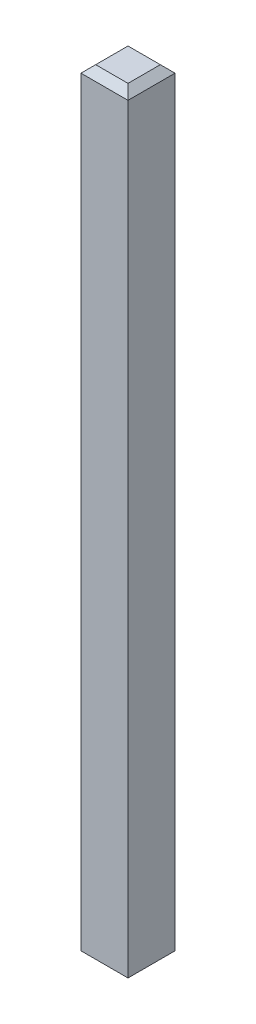
ISO-10303-21;
HEADER;
FILE_DESCRIPTION(('STEP AP214'),'2;1');
FILE_NAME('part.step','',(''),(''),'','','');
FILE_SCHEMA(('AUTOMOTIVE_DESIGN { 1 0 10303 214 1 1 1 1 }'));
ENDSEC;
DATA;
#1=APPLICATION_CONTEXT('core data for automotive mechanical design processes');
#2=APPLICATION_PROTOCOL_DEFINITION('international standard','automotive_design',2000,#1);
#3=PRODUCT_CONTEXT('',#1,'mechanical');
#4=PRODUCT('Part','Part','',(#3));
#5=PRODUCT_RELATED_PRODUCT_CATEGORY('part','',(#4));
#6=PRODUCT_DEFINITION_FORMATION('','',#4);
#7=PRODUCT_DEFINITION_CONTEXT('part definition',#1,'design');
#8=PRODUCT_DEFINITION('design','',#6,#7);
#9=PRODUCT_DEFINITION_SHAPE('','',#8);
#10=(LENGTH_UNIT() NAMED_UNIT(*) SI_UNIT(.MILLI.,.METRE.));
#11=(NAMED_UNIT(*) PLANE_ANGLE_UNIT() SI_UNIT($,.RADIAN.));
#12=(NAMED_UNIT(*) SI_UNIT($,.STERADIAN.) SOLID_ANGLE_UNIT());
#13=UNCERTAINTY_MEASURE_WITH_UNIT(LENGTH_MEASURE(1.E-05),#10,'distance_accuracy_value','');
#14=(GEOMETRIC_REPRESENTATION_CONTEXT(3) GLOBAL_UNCERTAINTY_ASSIGNED_CONTEXT((#13)) GLOBAL_UNIT_ASSIGNED_CONTEXT((#10,
#11,#12)) REPRESENTATION_CONTEXT('',''));
#15=CARTESIAN_POINT('',(0.,0.,0.));
#16=DIRECTION('',(0.,0.,1.));
#17=DIRECTION('',(1.,0.,0.));
#18=AXIS2_PLACEMENT_3D('',#15,#16,#17);
#19=CARTESIAN_POINT('',(9.160000014901,8.49,0.16));
#20=DIRECTION('',(0.707106781186548,0.707106781186548,0.));
#21=DIRECTION('',(-0.707106781186548,0.707106781186548,0.));
#22=AXIS2_PLACEMENT_3D('',#19,#20,#21);
#23=PLANE('',#22);
#24=DIRECTION('',(0.57735026918962,-0.57735026918963,-0.577350269189627));
#25=VECTOR('',#24,1.);
#26=CARTESIAN_POINT('',(9.110000014901,8.54,-0.220000000000001));
#27=LINE('',#26,#25);
#28=CARTESIAN_POINT('',(9.110000014901,8.54,-0.22));
#29=VERTEX_POINT('',#28);
#30=CARTESIAN_POINT('',(9.210000014901,8.44,-0.32));
#31=VERTEX_POINT('',#30);
#32=EDGE_CURVE('E84',#29,#31,#27,.T.);
#33=ORIENTED_EDGE('',*,*,#32,.F.);
#34=DIRECTION('',(0.,0.,1.));
#35=VECTOR('',#34,1.);
#36=CARTESIAN_POINT('',(9.110000014901,8.54,0.));
#37=LINE('',#36,#35);
#38=CARTESIAN_POINT('',(9.110000014901,8.54,0.22));
#39=VERTEX_POINT('',#38);
#40=EDGE_CURVE('E20',#39,#29,#37,.F.);
#41=ORIENTED_EDGE('',*,*,#40,.F.);
#42=DIRECTION('',(-0.57735026918962,0.57735026918963,-0.577350269189627));
#43=VECTOR('',#42,1.);
#44=CARTESIAN_POINT('',(9.210000014901,8.44,0.320000000000001));
#45=LINE('',#44,#43);
#46=CARTESIAN_POINT('',(9.210000014901,8.44,0.32));
#47=VERTEX_POINT('',#46);
#48=EDGE_CURVE('E110',#47,#39,#45,.T.);
#49=ORIENTED_EDGE('',*,*,#48,.F.);
#50=DIRECTION('',(0.,0.,-1.));
#51=VECTOR('',#50,1.);
#52=CARTESIAN_POINT('',(9.210000014901,8.44,0.32));
#53=LINE('',#52,#51);
#54=EDGE_CURVE('E88',#31,#47,#53,.F.);
#55=ORIENTED_EDGE('',*,*,#54,.F.);
#56=EDGE_LOOP('',(#33,#41,#49,#55));
#57=FACE_BOUND('',#56,.T.);
#58=ADVANCED_FACE('F17',(#57),#23,.T.);
#59=CARTESIAN_POINT('',(9.160000014901,-1.95,0.16));
#60=DIRECTION('',(0.707106781186548,-0.707106781186548,0.));
#61=DIRECTION('',(0.707106781186548,0.707106781186548,0.));
#62=AXIS2_PLACEMENT_3D('',#59,#60,#61);
#63=PLANE('',#62);
#64=DIRECTION('',(0.577350269189623,0.577350269189627,0.577350269189627));
#65=VECTOR('',#64,1.);
#66=CARTESIAN_POINT('',(9.110000014901,-2.,0.22));
#67=LINE('',#66,#65);
#68=CARTESIAN_POINT('',(9.110000014901,-2.,0.22));
#69=VERTEX_POINT('',#68);
#70=CARTESIAN_POINT('',(9.210000014901,-1.9,0.32));
#71=VERTEX_POINT('',#70);
#72=EDGE_CURVE('E116',#69,#71,#67,.T.);
#73=ORIENTED_EDGE('',*,*,#72,.F.);
#74=DIRECTION('',(0.,0.,1.));
#75=VECTOR('',#74,1.);
#76=CARTESIAN_POINT('',(9.110000014901,-2.,0.));
#77=LINE('',#76,#75);
#78=CARTESIAN_POINT('',(9.110000014901,-2.,-0.22));
#79=VERTEX_POINT('',#78);
#80=EDGE_CURVE('E79',#69,#79,#77,.F.);
#81=ORIENTED_EDGE('',*,*,#80,.T.);
#82=DIRECTION('',(-0.577350269189623,-0.577350269189627,0.577350269189627));
#83=VECTOR('',#82,1.);
#84=CARTESIAN_POINT('',(9.210000014901,-1.9,-0.32));
#85=LINE('',#84,#83);
#86=CARTESIAN_POINT('',(9.210000014901,-1.9,-0.32));
#87=VERTEX_POINT('',#86);
#88=EDGE_CURVE('E103',#87,#79,#85,.T.);
#89=ORIENTED_EDGE('',*,*,#88,.F.);
#90=DIRECTION('',(0.,0.,-1.));
#91=VECTOR('',#90,1.);
#92=CARTESIAN_POINT('',(9.210000014901,-1.9,0.32));
#93=LINE('',#92,#91);
#94=EDGE_CURVE('E119',#71,#87,#93,.T.);
#95=ORIENTED_EDGE('',*,*,#94,.F.);
#96=EDGE_LOOP('',(#73,#81,#89,#95));
#97=FACE_BOUND('',#96,.T.);
#98=ADVANCED_FACE('F282',(#97),#63,.T.);
#99=CARTESIAN_POINT('',(8.890000014901,8.54,0.));
#100=DIRECTION('',(0.,1.,0.));
#101=DIRECTION('',(0.,0.,1.));
#102=AXIS2_PLACEMENT_3D('',#99,#100,#101);
#103=PLANE('',#102);
#104=DIRECTION('',(0.,0.,1.));
#105=VECTOR('',#104,1.);
#106=CARTESIAN_POINT('',(8.670000014901,8.54,-0.16));
#107=LINE('',#106,#105);
#108=CARTESIAN_POINT('',(8.670000014901,8.54,0.22));
#109=VERTEX_POINT('',#108);
#110=CARTESIAN_POINT('',(8.670000014901,8.54,-0.22));
#111=VERTEX_POINT('',#110);
#112=EDGE_CURVE('E126',#109,#111,#107,.F.);
#113=ORIENTED_EDGE('',*,*,#112,.F.);
#114=DIRECTION('',(1.,0.,0.));
#115=VECTOR('',#114,1.);
#116=CARTESIAN_POINT('',(8.730000014901,8.54,0.220000000000001));
#117=LINE('',#116,#115);
#118=EDGE_CURVE('E97',#39,#109,#117,.F.);
#119=ORIENTED_EDGE('',*,*,#118,.F.);
#120=ORIENTED_EDGE('',*,*,#40,.T.);
#121=DIRECTION('',(1.,0.,0.));
#122=VECTOR('',#121,1.);
#123=CARTESIAN_POINT('',(9.050000014901,8.54,-0.220000000000001));
#124=LINE('',#123,#122);
#125=EDGE_CURVE('E92',#111,#29,#124,.T.);
#126=ORIENTED_EDGE('',*,*,#125,.F.);
#127=EDGE_LOOP('',(#113,#119,#120,#126));
#128=FACE_BOUND('',#127,.T.);
#129=ADVANCED_FACE('F95',(#128),#103,.T.);
#130=CARTESIAN_POINT('',(9.050000014901,8.49,-0.27));
#131=DIRECTION('',(0.,0.707106781186548,-0.707106781186548));
#132=DIRECTION('',(0.,0.707106781186548,0.707106781186548));
#133=AXIS2_PLACEMENT_3D('',#130,#131,#132);
#134=PLANE('',#133);
#135=DIRECTION('',(-0.577350269189625,-0.577350269189625,-0.577350269189628));
#136=VECTOR('',#135,1.);
#137=CARTESIAN_POINT('',(8.670000014901,8.54,-0.22));
#138=LINE('',#137,#136);
#139=CARTESIAN_POINT('',(8.570000014901,8.44,-0.320000000000001));
#140=VERTEX_POINT('',#139);
#141=EDGE_CURVE('E101',#111,#140,#138,.T.);
#142=ORIENTED_EDGE('',*,*,#141,.F.);
#143=ORIENTED_EDGE('',*,*,#125,.T.);
#144=ORIENTED_EDGE('',*,*,#32,.T.);
#145=DIRECTION('',(-1.,0.,0.));
#146=VECTOR('',#145,1.);
#147=CARTESIAN_POINT('',(9.210000014901,8.44,-0.32));
#148=LINE('',#147,#146);
#149=EDGE_CURVE('E128',#140,#31,#148,.F.);
#150=ORIENTED_EDGE('',*,*,#149,.F.);
#151=EDGE_LOOP('',(#142,#143,#144,#150));
#152=FACE_BOUND('',#151,.T.);
#153=ADVANCED_FACE('F99',(#152),#134,.T.);
#154=CARTESIAN_POINT('',(9.050000014901,-1.95,-0.27));
#155=DIRECTION('',(0.,-0.707106781186548,-0.707106781186548));
#156=DIRECTION('',(0.,0.707106781186548,-0.707106781186548));
#157=AXIS2_PLACEMENT_3D('',#154,#155,#156);
#158=PLANE('',#157);
#159=ORIENTED_EDGE('',*,*,#88,.T.);
#160=DIRECTION('',(1.,0.,0.));
#161=VECTOR('',#160,1.);
#162=CARTESIAN_POINT('',(8.890000014901,-2.,-0.22));
#163=LINE('',#162,#161);
#164=CARTESIAN_POINT('',(8.670000014901,-2.,-0.22));
#165=VERTEX_POINT('',#164);
#166=EDGE_CURVE('E108',#79,#165,#163,.F.);
#167=ORIENTED_EDGE('',*,*,#166,.T.);
#168=DIRECTION('',(0.577350269189628,-0.577350269189627,0.577350269189622));
#169=VECTOR('',#168,1.);
#170=CARTESIAN_POINT('',(8.570000014901,-1.9,-0.32));
#171=LINE('',#170,#169);
#172=CARTESIAN_POINT('',(8.570000014901,-1.9,-0.32));
#173=VERTEX_POINT('',#172);
#174=EDGE_CURVE('E137',#173,#165,#171,.T.);
#175=ORIENTED_EDGE('',*,*,#174,.F.);
#176=DIRECTION('',(-1.,0.,0.));
#177=VECTOR('',#176,1.);
#178=CARTESIAN_POINT('',(9.210000014901,-1.9,-0.32));
#179=LINE('',#178,#177);
#180=EDGE_CURVE('E134',#87,#173,#179,.T.);
#181=ORIENTED_EDGE('',*,*,#180,.F.);
#182=EDGE_LOOP('',(#159,#167,#175,#181));
#183=FACE_BOUND('',#182,.T.);
#184=ADVANCED_FACE('F258',(#183),#158,.T.);
#185=CARTESIAN_POINT('',(8.890000014901,-2.,0.));
#186=DIRECTION('',(0.,1.,0.));
#187=DIRECTION('',(0.,0.,1.));
#188=AXIS2_PLACEMENT_3D('',#185,#186,#187);
#189=PLANE('',#188);
#190=DIRECTION('',(0.,0.,1.));
#191=VECTOR('',#190,1.);
#192=CARTESIAN_POINT('',(8.670000014901,-2.,-0.16));
#193=LINE('',#192,#191);
#194=CARTESIAN_POINT('',(8.670000014901,-2.,0.22));
#195=VERTEX_POINT('',#194);
#196=EDGE_CURVE('E140',#165,#195,#193,.T.);
#197=ORIENTED_EDGE('',*,*,#196,.F.);
#198=ORIENTED_EDGE('',*,*,#166,.F.);
#199=ORIENTED_EDGE('',*,*,#80,.F.);
#200=DIRECTION('',(1.,0.,0.));
#201=VECTOR('',#200,1.);
#202=CARTESIAN_POINT('',(8.730000014901,-2.,0.22));
#203=LINE('',#202,#201);
#204=EDGE_CURVE('E113',#195,#69,#203,.T.);
#205=ORIENTED_EDGE('',*,*,#204,.F.);
#206=EDGE_LOOP('',(#197,#198,#199,#205));
#207=FACE_BOUND('',#206,.T.);
#208=ADVANCED_FACE('F250',(#207),#189,.F.);
#209=CARTESIAN_POINT('',(8.730000014901,8.49,0.27));
#210=DIRECTION('',(0.,0.707106781186548,0.707106781186548));
#211=DIRECTION('',(0.,-0.707106781186548,0.707106781186548));
#212=AXIS2_PLACEMENT_3D('',#209,#210,#211);
#213=PLANE('',#212);
#214=DIRECTION('',(0.577350269189624,0.577350269189624,-0.577350269189628));
#215=VECTOR('',#214,1.);
#216=CARTESIAN_POINT('',(8.570000014901,8.44,0.32));
#217=LINE('',#216,#215);
#218=CARTESIAN_POINT('',(8.570000014901,8.44,0.320000000000001));
#219=VERTEX_POINT('',#218);
#220=EDGE_CURVE('E123',#219,#109,#217,.T.);
#221=ORIENTED_EDGE('',*,*,#220,.F.);
#222=DIRECTION('',(1.,0.,0.));
#223=VECTOR('',#222,1.);
#224=CARTESIAN_POINT('',(8.570000014901,8.44,0.32));
#225=LINE('',#224,#223);
#226=EDGE_CURVE('E145',#47,#219,#225,.F.);
#227=ORIENTED_EDGE('',*,*,#226,.F.);
#228=ORIENTED_EDGE('',*,*,#48,.T.);
#229=ORIENTED_EDGE('',*,*,#118,.T.);
#230=EDGE_LOOP('',(#221,#227,#228,#229));
#231=FACE_BOUND('',#230,.T.);
#232=ADVANCED_FACE('F172',(#231),#213,.T.);
#233=CARTESIAN_POINT('',(8.730000014901,-1.95,0.27));
#234=DIRECTION('',(0.,-0.707106781186548,0.707106781186548));
#235=DIRECTION('',(0.,-0.707106781186548,-0.707106781186548));
#236=AXIS2_PLACEMENT_3D('',#233,#234,#235);
#237=PLANE('',#236);
#238=ORIENTED_EDGE('',*,*,#72,.T.);
#239=DIRECTION('',(1.,0.,0.));
#240=VECTOR('',#239,1.);
#241=CARTESIAN_POINT('',(8.570000014901,-1.9,0.32));
#242=LINE('',#241,#240);
#243=CARTESIAN_POINT('',(8.570000014901,-1.9,0.32));
#244=VERTEX_POINT('',#243);
#245=EDGE_CURVE('E35',#244,#71,#242,.T.);
#246=ORIENTED_EDGE('',*,*,#245,.F.);
#247=DIRECTION('',(-0.577350269189628,0.577350269189627,0.577350269189622));
#248=VECTOR('',#247,1.);
#249=CARTESIAN_POINT('',(8.670000014901,-2.,0.22));
#250=LINE('',#249,#248);
#251=EDGE_CURVE('E143',#195,#244,#250,.T.);
#252=ORIENTED_EDGE('',*,*,#251,.F.);
#253=ORIENTED_EDGE('',*,*,#204,.T.);
#254=EDGE_LOOP('',(#238,#246,#252,#253));
#255=FACE_BOUND('',#254,.T.);
#256=ADVANCED_FACE('F189',(#255),#237,.T.);
#257=CARTESIAN_POINT('',(9.210000014901,-2.,0.32));
#258=DIRECTION('',(1.,0.,0.));
#259=DIRECTION('',(0.,0.,-1.));
#260=AXIS2_PLACEMENT_3D('',#257,#258,#259);
#261=PLANE('',#260);
#262=ORIENTED_EDGE('',*,*,#94,.T.);
#263=DIRECTION('',(0.,1.,0.));
#264=VECTOR('',#263,1.);
#265=CARTESIAN_POINT('',(9.210000014901,-2.,-0.32));
#266=LINE('',#265,#264);
#267=EDGE_CURVE('E131',#31,#87,#266,.F.);
#268=ORIENTED_EDGE('',*,*,#267,.F.);
#269=ORIENTED_EDGE('',*,*,#54,.T.);
#270=DIRECTION('',(0.,1.,0.));
#271=VECTOR('',#270,1.);
#272=CARTESIAN_POINT('',(9.210000014901,-2.,0.32));
#273=LINE('',#272,#271);
#274=EDGE_CURVE('E149',#71,#47,#273,.T.);
#275=ORIENTED_EDGE('',*,*,#274,.F.);
#276=EDGE_LOOP('',(#262,#268,#269,#275));
#277=FACE_BOUND('',#276,.T.);
#278=ADVANCED_FACE('F175',(#277),#261,.T.);
#279=CARTESIAN_POINT('',(8.620000014901,8.49,-0.16));
#280=DIRECTION('',(-0.707106781186548,0.707106781186548,0.));
#281=DIRECTION('',(-0.707106781186548,-0.707106781186548,0.));
#282=AXIS2_PLACEMENT_3D('',#279,#280,#281);
#283=PLANE('',#282);
#284=ORIENTED_EDGE('',*,*,#220,.T.);
#285=ORIENTED_EDGE('',*,*,#112,.T.);
#286=ORIENTED_EDGE('',*,*,#141,.T.);
#287=DIRECTION('',(0.,0.,1.));
#288=VECTOR('',#287,1.);
#289=CARTESIAN_POINT('',(8.570000014901,8.44,-0.32));
#290=LINE('',#289,#288);
#291=EDGE_CURVE('E152',#219,#140,#290,.F.);
#292=ORIENTED_EDGE('',*,*,#291,.F.);
#293=EDGE_LOOP('',(#284,#285,#286,#292));
#294=FACE_BOUND('',#293,.T.);
#295=ADVANCED_FACE('F180',(#294),#283,.T.);
#296=CARTESIAN_POINT('',(9.210000014901,-2.,-0.32));
#297=DIRECTION('',(0.,0.,-1.));
#298=DIRECTION('',(-1.,0.,0.));
#299=AXIS2_PLACEMENT_3D('',#296,#297,#298);
#300=PLANE('',#299);
#301=ORIENTED_EDGE('',*,*,#180,.T.);
#302=DIRECTION('',(0.,1.,0.));
#303=VECTOR('',#302,1.);
#304=CARTESIAN_POINT('',(8.570000014901,-2.,-0.32));
#305=LINE('',#304,#303);
#306=EDGE_CURVE('E155',#140,#173,#305,.F.);
#307=ORIENTED_EDGE('',*,*,#306,.F.);
#308=ORIENTED_EDGE('',*,*,#149,.T.);
#309=ORIENTED_EDGE('',*,*,#267,.T.);
#310=EDGE_LOOP('',(#301,#307,#308,#309));
#311=FACE_BOUND('',#310,.T.);
#312=ADVANCED_FACE('F178',(#311),#300,.T.);
#313=CARTESIAN_POINT('',(8.620000014901,-1.95,-0.16));
#314=DIRECTION('',(-0.707106781186548,-0.707106781186548,0.));
#315=DIRECTION('',(0.707106781186548,-0.707106781186548,0.));
#316=AXIS2_PLACEMENT_3D('',#313,#314,#315);
#317=PLANE('',#316);
#318=ORIENTED_EDGE('',*,*,#251,.T.);
#319=DIRECTION('',(0.,0.,1.));
#320=VECTOR('',#319,1.);
#321=CARTESIAN_POINT('',(8.570000014901,-1.9,-0.32));
#322=LINE('',#321,#320);
#323=EDGE_CURVE('E26',#173,#244,#322,.T.);
#324=ORIENTED_EDGE('',*,*,#323,.F.);
#325=ORIENTED_EDGE('',*,*,#174,.T.);
#326=ORIENTED_EDGE('',*,*,#196,.T.);
#327=EDGE_LOOP('',(#318,#324,#325,#326));
#328=FACE_BOUND('',#327,.T.);
#329=ADVANCED_FACE('F165',(#328),#317,.T.);
#330=CARTESIAN_POINT('',(8.570000014901,-2.,0.32));
#331=DIRECTION('',(0.,0.,1.));
#332=DIRECTION('',(1.,0.,0.));
#333=AXIS2_PLACEMENT_3D('',#330,#331,#332);
#334=PLANE('',#333);
#335=ORIENTED_EDGE('',*,*,#245,.T.);
#336=ORIENTED_EDGE('',*,*,#274,.T.);
#337=ORIENTED_EDGE('',*,*,#226,.T.);
#338=DIRECTION('',(0.,1.,0.));
#339=VECTOR('',#338,1.);
#340=CARTESIAN_POINT('',(8.570000014901,-2.,0.32));
#341=LINE('',#340,#339);
#342=EDGE_CURVE('E11',#244,#219,#341,.T.);
#343=ORIENTED_EDGE('',*,*,#342,.F.);
#344=EDGE_LOOP('',(#335,#336,#337,#343));
#345=FACE_BOUND('',#344,.T.);
#346=ADVANCED_FACE('F168',(#345),#334,.T.);
#347=CARTESIAN_POINT('',(8.570000014901,-2.,-0.32));
#348=DIRECTION('',(-1.,0.,0.));
#349=DIRECTION('',(0.,0.,1.));
#350=AXIS2_PLACEMENT_3D('',#347,#348,#349);
#351=PLANE('',#350);
#352=ORIENTED_EDGE('',*,*,#323,.T.);
#353=ORIENTED_EDGE('',*,*,#342,.T.);
#354=ORIENTED_EDGE('',*,*,#291,.T.);
#355=ORIENTED_EDGE('',*,*,#306,.T.);
#356=EDGE_LOOP('',(#352,#353,#354,#355));
#357=FACE_BOUND('',#356,.T.);
#358=ADVANCED_FACE('F161',(#357),#351,.T.);
#359=CLOSED_SHELL('',(#58,#98,#129,#153,#184,#208,#232,#256,#278,#295,#312,#329,#346,#358));
#360=MANIFOLD_SOLID_BREP('B1',#359);
#361=ADVANCED_BREP_SHAPE_REPRESENTATION('',(#18,#360),#14);
#362=SHAPE_DEFINITION_REPRESENTATION(#9,#361);
ENDSEC;
END-ISO-10303-21;
